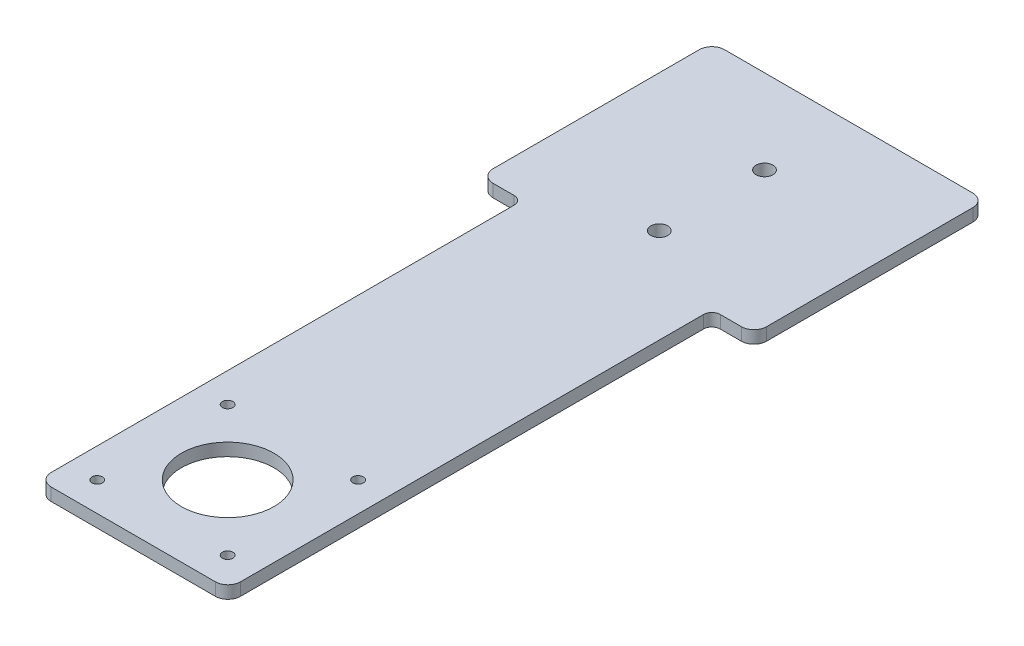
ISO-10303-21;
HEADER;
FILE_DESCRIPTION(('STEP AP214'),'2;1');
FILE_NAME('part.step','',(''),(''),'','','');
FILE_SCHEMA(('AUTOMOTIVE_DESIGN { 1 0 10303 214 1 1 1 1 }'));
ENDSEC;
DATA;
#1=APPLICATION_CONTEXT('core data for automotive mechanical design processes');
#2=APPLICATION_PROTOCOL_DEFINITION('international standard','automotive_design',2000,#1);
#3=PRODUCT_CONTEXT('',#1,'mechanical');
#4=PRODUCT('Part','Part','',(#3));
#5=PRODUCT_RELATED_PRODUCT_CATEGORY('part','',(#4));
#6=PRODUCT_DEFINITION_FORMATION('','',#4);
#7=PRODUCT_DEFINITION_CONTEXT('part definition',#1,'design');
#8=PRODUCT_DEFINITION('design','',#6,#7);
#9=PRODUCT_DEFINITION_SHAPE('','',#8);
#10=(LENGTH_UNIT() NAMED_UNIT(*) SI_UNIT(.MILLI.,.METRE.));
#11=(NAMED_UNIT(*) PLANE_ANGLE_UNIT() SI_UNIT($,.RADIAN.));
#12=(NAMED_UNIT(*) SI_UNIT($,.STERADIAN.) SOLID_ANGLE_UNIT());
#13=UNCERTAINTY_MEASURE_WITH_UNIT(LENGTH_MEASURE(1.E-05),#10,'distance_accuracy_value','');
#14=(GEOMETRIC_REPRESENTATION_CONTEXT(3) GLOBAL_UNCERTAINTY_ASSIGNED_CONTEXT((#13)) GLOBAL_UNIT_ASSIGNED_CONTEXT((#10,
#11,#12)) REPRESENTATION_CONTEXT('',''));
#15=CARTESIAN_POINT('',(0.,0.,0.));
#16=DIRECTION('',(0.,0.,1.));
#17=DIRECTION('',(1.,0.,0.));
#18=AXIS2_PLACEMENT_3D('',#15,#16,#17);
#19=CARTESIAN_POINT('',(-32.5,3.,0.));
#20=DIRECTION('',(1.,0.,0.));
#21=DIRECTION('',(0.,0.,-1.));
#22=AXIS2_PLACEMENT_3D('',#19,#20,#21);
#23=PLANE('',#22);
#24=DIRECTION('',(0.,0.,1.));
#25=VECTOR('',#24,1.);
#26=CARTESIAN_POINT('',(-32.5,0.,0.));
#27=LINE('',#26,#25);
#28=CARTESIAN_POINT('',(-32.5,0.,-108.613624170187));
#29=VERTEX_POINT('',#28);
#30=CARTESIAN_POINT('',(-32.5,0.,-59.6136241701869));
#31=VERTEX_POINT('',#30);
#32=EDGE_CURVE('E269',#29,#31,#27,.T.);
#33=ORIENTED_EDGE('',*,*,#32,.T.);
#34=DIRECTION('',(0.,-1.,0.));
#35=VECTOR('',#34,1.);
#36=CARTESIAN_POINT('',(-32.5,3.,-59.6136241701869));
#37=LINE('',#36,#35);
#38=CARTESIAN_POINT('',(-32.5,3.,-59.6136241701869));
#39=VERTEX_POINT('',#38);
#40=EDGE_CURVE('E202',#31,#39,#37,.F.);
#41=ORIENTED_EDGE('',*,*,#40,.T.);
#42=DIRECTION('',(0.,0.,1.));
#43=VECTOR('',#42,1.);
#44=CARTESIAN_POINT('',(-32.5,3.,0.));
#45=LINE('',#44,#43);
#46=CARTESIAN_POINT('',(-32.5,3.,-108.613624170187));
#47=VERTEX_POINT('',#46);
#48=EDGE_CURVE('E306',#47,#39,#45,.T.);
#49=ORIENTED_EDGE('',*,*,#48,.F.);
#50=DIRECTION('',(0.,-1.,0.));
#51=VECTOR('',#50,1.);
#52=CARTESIAN_POINT('',(-32.5,0.,-108.613624170187));
#53=LINE('',#52,#51);
#54=EDGE_CURVE('E189',#47,#29,#53,.T.);
#55=ORIENTED_EDGE('',*,*,#54,.T.);
#56=EDGE_LOOP('',(#33,#41,#49,#55));
#57=FACE_BOUND('',#56,.T.);
#58=ADVANCED_FACE('F41',(#57),#23,.F.);
#59=CARTESIAN_POINT('',(0.,3.,-56.613624170187));
#60=DIRECTION('',(0.,0.,-1.));
#61=DIRECTION('',(-1.,0.,0.));
#62=AXIS2_PLACEMENT_3D('',#59,#60,#61);
#63=PLANE('',#62);
#64=DIRECTION('',(1.,0.,0.));
#65=VECTOR('',#64,1.);
#66=CARTESIAN_POINT('',(0.,0.,-56.613624170187));
#67=LINE('',#66,#65);
#68=CARTESIAN_POINT('',(-29.5,0.,-56.6136241701869));
#69=VERTEX_POINT('',#68);
#70=CARTESIAN_POINT('',(-24.5,0.,-56.613624170187));
#71=VERTEX_POINT('',#70);
#72=EDGE_CURVE('E266',#69,#71,#67,.T.);
#73=ORIENTED_EDGE('',*,*,#72,.T.);
#74=DIRECTION('',(0.,-1.,0.));
#75=VECTOR('',#74,1.);
#76=CARTESIAN_POINT('',(-24.5,3.,-56.613624170187));
#77=LINE('',#76,#75);
#78=CARTESIAN_POINT('',(-24.5,3.,-56.613624170187));
#79=VERTEX_POINT('',#78);
#80=EDGE_CURVE('E238',#71,#79,#77,.F.);
#81=ORIENTED_EDGE('',*,*,#80,.T.);
#82=DIRECTION('',(1.,0.,0.));
#83=VECTOR('',#82,1.);
#84=CARTESIAN_POINT('',(0.,3.,-56.613624170187));
#85=LINE('',#84,#83);
#86=CARTESIAN_POINT('',(-29.5,3.,-56.6136241701869));
#87=VERTEX_POINT('',#86);
#88=EDGE_CURVE('E303',#87,#79,#85,.T.);
#89=ORIENTED_EDGE('',*,*,#88,.F.);
#90=DIRECTION('',(0.,-1.,0.));
#91=VECTOR('',#90,1.);
#92=CARTESIAN_POINT('',(-29.5,3.,-56.6136241701869));
#93=LINE('',#92,#91);
#94=EDGE_CURVE('E197',#87,#69,#93,.T.);
#95=ORIENTED_EDGE('',*,*,#94,.T.);
#96=EDGE_LOOP('',(#73,#81,#89,#95));
#97=FACE_BOUND('',#96,.T.);
#98=ADVANCED_FACE('F347',(#97),#63,.F.);
#99=CARTESIAN_POINT('',(-22.5,3.,0.));
#100=DIRECTION('',(-1.,0.,0.));
#101=DIRECTION('',(0.,0.,1.));
#102=AXIS2_PLACEMENT_3D('',#99,#100,#101);
#103=PLANE('',#102);
#104=DIRECTION('',(0.,0.,-1.));
#105=VECTOR('',#104,1.);
#106=CARTESIAN_POINT('',(-22.5,3.,0.));
#107=LINE('',#106,#105);
#108=CARTESIAN_POINT('',(-22.5,3.,55.3863758298131));
#109=VERTEX_POINT('',#108);
#110=CARTESIAN_POINT('',(-22.5,3.,-54.6136241701869));
#111=VERTEX_POINT('',#110);
#112=EDGE_CURVE('E300',#109,#111,#107,.T.);
#113=ORIENTED_EDGE('',*,*,#112,.T.);
#114=DIRECTION('',(0.,-1.,0.));
#115=VECTOR('',#114,1.);
#116=CARTESIAN_POINT('',(-22.5,3.,-54.6136241701869));
#117=LINE('',#116,#115);
#118=CARTESIAN_POINT('',(-22.5,0.,-54.6136241701869));
#119=VERTEX_POINT('',#118);
#120=EDGE_CURVE('E235',#111,#119,#117,.T.);
#121=ORIENTED_EDGE('',*,*,#120,.T.);
#122=DIRECTION('',(0.,0.,-1.));
#123=VECTOR('',#122,1.);
#124=CARTESIAN_POINT('',(-22.5,0.,0.));
#125=LINE('',#124,#123);
#126=CARTESIAN_POINT('',(-22.5,0.,55.3863758298131));
#127=VERTEX_POINT('',#126);
#128=EDGE_CURVE('E263',#127,#119,#125,.T.);
#129=ORIENTED_EDGE('',*,*,#128,.F.);
#130=DIRECTION('',(0.,-1.,0.));
#131=VECTOR('',#130,1.);
#132=CARTESIAN_POINT('',(-22.5,3.,55.3863758298131));
#133=LINE('',#132,#131);
#134=EDGE_CURVE('E231',#127,#109,#133,.F.);
#135=ORIENTED_EDGE('',*,*,#134,.T.);
#136=EDGE_LOOP('',(#113,#121,#129,#135));
#137=FACE_BOUND('',#136,.T.);
#138=ADVANCED_FACE('F353',(#137),#103,.T.);
#139=CARTESIAN_POINT('',(0.,3.,58.3863758298131));
#140=DIRECTION('',(0.,0.,1.));
#141=DIRECTION('',(1.,0.,0.));
#142=AXIS2_PLACEMENT_3D('',#139,#140,#141);
#143=PLANE('',#142);
#144=DIRECTION('',(-1.,0.,0.));
#145=VECTOR('',#144,1.);
#146=CARTESIAN_POINT('',(0.,3.,58.3863758298131));
#147=LINE('',#146,#145);
#148=CARTESIAN_POINT('',(19.5,3.,58.3863758298131));
#149=VERTEX_POINT('',#148);
#150=CARTESIAN_POINT('',(-19.5,3.,58.3863758298131));
#151=VERTEX_POINT('',#150);
#152=EDGE_CURVE('E297',#149,#151,#147,.T.);
#153=ORIENTED_EDGE('',*,*,#152,.T.);
#154=DIRECTION('',(0.,-1.,0.));
#155=VECTOR('',#154,1.);
#156=CARTESIAN_POINT('',(-19.5,3.,58.3863758298131));
#157=LINE('',#156,#155);
#158=CARTESIAN_POINT('',(-19.5,0.,58.3863758298131));
#159=VERTEX_POINT('',#158);
#160=EDGE_CURVE('E226',#151,#159,#157,.T.);
#161=ORIENTED_EDGE('',*,*,#160,.T.);
#162=DIRECTION('',(-1.,0.,0.));
#163=VECTOR('',#162,1.);
#164=CARTESIAN_POINT('',(0.,0.,58.3863758298131));
#165=LINE('',#164,#163);
#166=CARTESIAN_POINT('',(19.5,0.,58.3863758298131));
#167=VERTEX_POINT('',#166);
#168=EDGE_CURVE('E259',#167,#159,#165,.T.);
#169=ORIENTED_EDGE('',*,*,#168,.F.);
#170=DIRECTION('',(0.,-1.,0.));
#171=VECTOR('',#170,1.);
#172=CARTESIAN_POINT('',(19.5,3.,58.3863758298131));
#173=LINE('',#172,#171);
#174=EDGE_CURVE('E222',#167,#149,#173,.F.);
#175=ORIENTED_EDGE('',*,*,#174,.T.);
#176=EDGE_LOOP('',(#153,#161,#169,#175));
#177=FACE_BOUND('',#176,.T.);
#178=ADVANCED_FACE('F420',(#177),#143,.T.);
#179=CARTESIAN_POINT('',(22.5,3.,0.));
#180=DIRECTION('',(-1.,0.,0.));
#181=DIRECTION('',(0.,0.,1.));
#182=AXIS2_PLACEMENT_3D('',#179,#180,#181);
#183=PLANE('',#182);
#184=DIRECTION('',(0.,0.,-1.));
#185=VECTOR('',#184,1.);
#186=CARTESIAN_POINT('',(22.5,0.,0.));
#187=LINE('',#186,#185);
#188=CARTESIAN_POINT('',(22.5,0.,55.3863758298131));
#189=VERTEX_POINT('',#188);
#190=CARTESIAN_POINT('',(22.5,0.,-54.6136241701869));
#191=VERTEX_POINT('',#190);
#192=EDGE_CURVE('E256',#189,#191,#187,.T.);
#193=ORIENTED_EDGE('',*,*,#192,.T.);
#194=DIRECTION('',(0.,-1.,0.));
#195=VECTOR('',#194,1.);
#196=CARTESIAN_POINT('',(22.5,3.,-54.6136241701869));
#197=LINE('',#196,#195);
#198=CARTESIAN_POINT('',(22.5,3.,-54.6136241701869));
#199=VERTEX_POINT('',#198);
#200=EDGE_CURVE('E62',#191,#199,#197,.F.);
#201=ORIENTED_EDGE('',*,*,#200,.T.);
#202=DIRECTION('',(0.,0.,-1.));
#203=VECTOR('',#202,1.);
#204=CARTESIAN_POINT('',(22.5,3.,0.));
#205=LINE('',#204,#203);
#206=CARTESIAN_POINT('',(22.5,3.,55.3863758298131));
#207=VERTEX_POINT('',#206);
#208=EDGE_CURVE('E295',#207,#199,#205,.T.);
#209=ORIENTED_EDGE('',*,*,#208,.F.);
#210=DIRECTION('',(0.,-1.,0.));
#211=VECTOR('',#210,1.);
#212=CARTESIAN_POINT('',(22.5,0.,55.3863758298131));
#213=LINE('',#212,#211);
#214=EDGE_CURVE('E217',#207,#189,#213,.T.);
#215=ORIENTED_EDGE('',*,*,#214,.T.);
#216=EDGE_LOOP('',(#193,#201,#209,#215));
#217=FACE_BOUND('',#216,.T.);
#218=ADVANCED_FACE('F424',(#217),#183,.F.);
#219=CARTESIAN_POINT('',(0.,3.,-56.613624170187));
#220=DIRECTION('',(0.,0.,-1.));
#221=DIRECTION('',(-1.,0.,0.));
#222=AXIS2_PLACEMENT_3D('',#219,#220,#221);
#223=PLANE('',#222);
#224=DIRECTION('',(1.,0.,0.));
#225=VECTOR('',#224,1.);
#226=CARTESIAN_POINT('',(0.,3.,-56.613624170187));
#227=LINE('',#226,#225);
#228=CARTESIAN_POINT('',(24.5,3.,-56.613624170187));
#229=VERTEX_POINT('',#228);
#230=CARTESIAN_POINT('',(29.5,3.,-56.6136241701869));
#231=VERTEX_POINT('',#230);
#232=EDGE_CURVE('E252',#229,#231,#227,.T.);
#233=ORIENTED_EDGE('',*,*,#232,.F.);
#234=DIRECTION('',(0.,-1.,0.));
#235=VECTOR('',#234,1.);
#236=CARTESIAN_POINT('',(24.5,0.,-56.613624170187));
#237=LINE('',#236,#235);
#238=CARTESIAN_POINT('',(24.5,0.,-56.613624170187));
#239=VERTEX_POINT('',#238);
#240=EDGE_CURVE('E244',#229,#239,#237,.T.);
#241=ORIENTED_EDGE('',*,*,#240,.T.);
#242=DIRECTION('',(1.,0.,0.));
#243=VECTOR('',#242,1.);
#244=CARTESIAN_POINT('',(0.,0.,-56.613624170187));
#245=LINE('',#244,#243);
#246=CARTESIAN_POINT('',(29.5,0.,-56.6136241701869));
#247=VERTEX_POINT('',#246);
#248=EDGE_CURVE('E251',#239,#247,#245,.T.);
#249=ORIENTED_EDGE('',*,*,#248,.T.);
#250=DIRECTION('',(0.,-1.,0.));
#251=VECTOR('',#250,1.);
#252=CARTESIAN_POINT('',(29.5,3.,-56.6136241701869));
#253=LINE('',#252,#251);
#254=EDGE_CURVE('E212',#247,#231,#253,.F.);
#255=ORIENTED_EDGE('',*,*,#254,.T.);
#256=EDGE_LOOP('',(#233,#241,#249,#255));
#257=FACE_BOUND('',#256,.T.);
#258=ADVANCED_FACE('F250',(#257),#223,.F.);
#259=CARTESIAN_POINT('',(32.5,3.,0.));
#260=DIRECTION('',(1.,0.,0.));
#261=DIRECTION('',(0.,0.,-1.));
#262=AXIS2_PLACEMENT_3D('',#259,#260,#261);
#263=PLANE('',#262);
#264=DIRECTION('',(0.,0.,1.));
#265=VECTOR('',#264,1.);
#266=CARTESIAN_POINT('',(32.5,3.,0.));
#267=LINE('',#266,#265);
#268=CARTESIAN_POINT('',(32.5,3.,-108.613624170187));
#269=VERTEX_POINT('',#268);
#270=CARTESIAN_POINT('',(32.5,3.,-59.6136241701869));
#271=VERTEX_POINT('',#270);
#272=EDGE_CURVE('E291',#269,#271,#267,.T.);
#273=ORIENTED_EDGE('',*,*,#272,.T.);
#274=DIRECTION('',(0.,-1.,0.));
#275=VECTOR('',#274,1.);
#276=CARTESIAN_POINT('',(32.5,0.,-59.6136241701869));
#277=LINE('',#276,#275);
#278=CARTESIAN_POINT('',(32.5,0.,-59.6136241701869));
#279=VERTEX_POINT('',#278);
#280=EDGE_CURVE('E206',#271,#279,#277,.T.);
#281=ORIENTED_EDGE('',*,*,#280,.T.);
#282=DIRECTION('',(0.,0.,1.));
#283=VECTOR('',#282,1.);
#284=CARTESIAN_POINT('',(32.5,0.,0.));
#285=LINE('',#284,#283);
#286=CARTESIAN_POINT('',(32.5,0.,-108.613624170187));
#287=VERTEX_POINT('',#286);
#288=EDGE_CURVE('E166',#287,#279,#285,.T.);
#289=ORIENTED_EDGE('',*,*,#288,.F.);
#290=DIRECTION('',(0.,-1.,0.));
#291=VECTOR('',#290,1.);
#292=CARTESIAN_POINT('',(32.5,3.,-108.613624170187));
#293=LINE('',#292,#291);
#294=EDGE_CURVE('E174',#287,#269,#293,.F.);
#295=ORIENTED_EDGE('',*,*,#294,.T.);
#296=EDGE_LOOP('',(#273,#281,#289,#295));
#297=FACE_BOUND('',#296,.T.);
#298=ADVANCED_FACE('F436',(#297),#263,.T.);
#299=CARTESIAN_POINT('',(0.,3.,-111.613624170187));
#300=DIRECTION('',(0.,0.,-1.));
#301=DIRECTION('',(-1.,0.,0.));
#302=AXIS2_PLACEMENT_3D('',#299,#300,#301);
#303=PLANE('',#302);
#304=DIRECTION('',(1.,0.,0.));
#305=VECTOR('',#304,1.);
#306=CARTESIAN_POINT('',(0.,0.,-111.613624170187));
#307=LINE('',#306,#305);
#308=CARTESIAN_POINT('',(-29.5,0.,-111.613624170187));
#309=VERTEX_POINT('',#308);
#310=CARTESIAN_POINT('',(29.5,0.,-111.613624170187));
#311=VERTEX_POINT('',#310);
#312=EDGE_CURVE('E152',#309,#311,#307,.T.);
#313=ORIENTED_EDGE('',*,*,#312,.F.);
#314=DIRECTION('',(0.,-1.,0.));
#315=VECTOR('',#314,1.);
#316=CARTESIAN_POINT('',(-29.5,3.,-111.613624170187));
#317=LINE('',#316,#315);
#318=CARTESIAN_POINT('',(-29.5,3.,-111.613624170187));
#319=VERTEX_POINT('',#318);
#320=EDGE_CURVE('E193',#309,#319,#317,.F.);
#321=ORIENTED_EDGE('',*,*,#320,.T.);
#322=DIRECTION('',(1.,0.,0.));
#323=VECTOR('',#322,1.);
#324=CARTESIAN_POINT('',(0.,3.,-111.613624170187));
#325=LINE('',#324,#323);
#326=CARTESIAN_POINT('',(29.5,3.,-111.613624170187));
#327=VERTEX_POINT('',#326);
#328=EDGE_CURVE('E178',#319,#327,#325,.T.);
#329=ORIENTED_EDGE('',*,*,#328,.T.);
#330=DIRECTION('',(0.,-1.,0.));
#331=VECTOR('',#330,1.);
#332=CARTESIAN_POINT('',(29.5,3.,-111.613624170187));
#333=LINE('',#332,#331);
#334=EDGE_CURVE('E173',#327,#311,#333,.T.);
#335=ORIENTED_EDGE('',*,*,#334,.T.);
#336=EDGE_LOOP('',(#313,#321,#329,#335));
#337=FACE_BOUND('',#336,.T.);
#338=ADVANCED_FACE('F176',(#337),#303,.T.);
#339=CARTESIAN_POINT('',(0.,3.,-91.6136241701869));
#340=DIRECTION('',(0.,-1.,0.));
#341=DIRECTION('',(0.,0.,-1.));
#342=AXIS2_PLACEMENT_3D('',#339,#340,#341);
#343=CYLINDRICAL_SURFACE('',#342,2.);
#344=CARTESIAN_POINT('',(0.,3.,-91.6136241701869));
#345=DIRECTION('',(0.,1.,0.));
#346=DIRECTION('',(0.,0.,1.));
#347=AXIS2_PLACEMENT_3D('',#344,#345,#346);
#348=CIRCLE('',#347,2.);
#349=CARTESIAN_POINT('',(0.,3.,-89.6136241701869));
#350=VERTEX_POINT('',#349);
#351=EDGE_CURVE('E309',#350,#350,#348,.T.);
#352=ORIENTED_EDGE('',*,*,#351,.T.);
#353=EDGE_LOOP('',(#352));
#354=FACE_BOUND('',#353,.T.);
#355=CARTESIAN_POINT('',(0.,0.,-91.6136241701869));
#356=DIRECTION('',(0.,1.,0.));
#357=DIRECTION('',(0.,0.,1.));
#358=AXIS2_PLACEMENT_3D('',#355,#356,#357);
#359=CIRCLE('',#358,2.);
#360=CARTESIAN_POINT('',(0.,0.,-89.6136241701869));
#361=VERTEX_POINT('',#360);
#362=EDGE_CURVE('E272',#361,#361,#359,.T.);
#363=ORIENTED_EDGE('',*,*,#362,.F.);
#364=EDGE_LOOP('',(#363));
#365=FACE_BOUND('',#364,.T.);
#366=ADVANCED_FACE('F358',(#354,#365),#343,.F.);
#367=CARTESIAN_POINT('',(0.,3.,-66.6136241701869));
#368=DIRECTION('',(0.,-1.,0.));
#369=DIRECTION('',(0.,0.,-1.));
#370=AXIS2_PLACEMENT_3D('',#367,#368,#369);
#371=CYLINDRICAL_SURFACE('',#370,2.);
#372=CARTESIAN_POINT('',(0.,3.,-66.6136241701869));
#373=DIRECTION('',(0.,1.,0.));
#374=DIRECTION('',(0.,0.,1.));
#375=AXIS2_PLACEMENT_3D('',#372,#373,#374);
#376=CIRCLE('',#375,2.);
#377=CARTESIAN_POINT('',(0.,3.,-64.6136241701869));
#378=VERTEX_POINT('',#377);
#379=EDGE_CURVE('E312',#378,#378,#376,.T.);
#380=ORIENTED_EDGE('',*,*,#379,.T.);
#381=EDGE_LOOP('',(#380));
#382=FACE_BOUND('',#381,.T.);
#383=CARTESIAN_POINT('',(0.,0.,-66.6136241701869));
#384=DIRECTION('',(0.,1.,0.));
#385=DIRECTION('',(0.,0.,1.));
#386=AXIS2_PLACEMENT_3D('',#383,#384,#385);
#387=CIRCLE('',#386,2.);
#388=CARTESIAN_POINT('',(0.,0.,-64.6136241701869));
#389=VERTEX_POINT('',#388);
#390=EDGE_CURVE('E275',#389,#389,#387,.T.);
#391=ORIENTED_EDGE('',*,*,#390,.F.);
#392=EDGE_LOOP('',(#391));
#393=FACE_BOUND('',#392,.T.);
#394=ADVANCED_FACE('F361',(#382,#393),#371,.F.);
#395=CARTESIAN_POINT('',(-15.5,3.,20.4540396754964));
#396=DIRECTION('',(0.,-1.,0.));
#397=DIRECTION('',(0.,0.,-1.));
#398=AXIS2_PLACEMENT_3D('',#395,#396,#397);
#399=CYLINDRICAL_SURFACE('',#398,1.25);
#400=CARTESIAN_POINT('',(-15.5,3.,20.4540396754964));
#401=DIRECTION('',(0.,1.,0.));
#402=DIRECTION('',(0.,0.,1.));
#403=AXIS2_PLACEMENT_3D('',#400,#401,#402);
#404=CIRCLE('',#403,1.25);
#405=CARTESIAN_POINT('',(-15.5,3.,21.7040396754964));
#406=VERTEX_POINT('',#405);
#407=EDGE_CURVE('E315',#406,#406,#404,.T.);
#408=ORIENTED_EDGE('',*,*,#407,.T.);
#409=EDGE_LOOP('',(#408));
#410=FACE_BOUND('',#409,.T.);
#411=CARTESIAN_POINT('',(-15.5,0.,20.4540396754964));
#412=DIRECTION('',(0.,1.,0.));
#413=DIRECTION('',(0.,0.,1.));
#414=AXIS2_PLACEMENT_3D('',#411,#412,#413);
#415=CIRCLE('',#414,1.25);
#416=CARTESIAN_POINT('',(-15.5,0.,21.7040396754964));
#417=VERTEX_POINT('',#416);
#418=EDGE_CURVE('E278',#417,#417,#415,.T.);
#419=ORIENTED_EDGE('',*,*,#418,.F.);
#420=EDGE_LOOP('',(#419));
#421=FACE_BOUND('',#420,.T.);
#422=ADVANCED_FACE('F365',(#410,#421),#399,.F.);
#423=CARTESIAN_POINT('',(-15.5,3.,51.4540396754964));
#424=DIRECTION('',(0.,-1.,0.));
#425=DIRECTION('',(0.,0.,-1.));
#426=AXIS2_PLACEMENT_3D('',#423,#424,#425);
#427=CYLINDRICAL_SURFACE('',#426,1.25);
#428=CARTESIAN_POINT('',(-15.5,3.,51.4540396754964));
#429=DIRECTION('',(0.,1.,0.));
#430=DIRECTION('',(0.,0.,1.));
#431=AXIS2_PLACEMENT_3D('',#428,#429,#430);
#432=CIRCLE('',#431,1.25);
#433=CARTESIAN_POINT('',(-15.5,3.,52.7040396754964));
#434=VERTEX_POINT('',#433);
#435=EDGE_CURVE('E318',#434,#434,#432,.T.);
#436=ORIENTED_EDGE('',*,*,#435,.T.);
#437=EDGE_LOOP('',(#436));
#438=FACE_BOUND('',#437,.T.);
#439=CARTESIAN_POINT('',(-15.5,0.,51.4540396754964));
#440=DIRECTION('',(0.,1.,0.));
#441=DIRECTION('',(0.,0.,1.));
#442=AXIS2_PLACEMENT_3D('',#439,#440,#441);
#443=CIRCLE('',#442,1.25);
#444=CARTESIAN_POINT('',(-15.5,0.,52.7040396754964));
#445=VERTEX_POINT('',#444);
#446=EDGE_CURVE('E281',#445,#445,#443,.T.);
#447=ORIENTED_EDGE('',*,*,#446,.F.);
#448=EDGE_LOOP('',(#447));
#449=FACE_BOUND('',#448,.T.);
#450=ADVANCED_FACE('F369',(#438,#449),#427,.F.);
#451=CARTESIAN_POINT('',(15.5,3.,51.4540396754964));
#452=DIRECTION('',(0.,-1.,0.));
#453=DIRECTION('',(0.,0.,-1.));
#454=AXIS2_PLACEMENT_3D('',#451,#452,#453);
#455=CYLINDRICAL_SURFACE('',#454,1.25);
#456=CARTESIAN_POINT('',(15.5,3.,51.4540396754964));
#457=DIRECTION('',(0.,1.,0.));
#458=DIRECTION('',(0.,0.,1.));
#459=AXIS2_PLACEMENT_3D('',#456,#457,#458);
#460=CIRCLE('',#459,1.25);
#461=CARTESIAN_POINT('',(15.5,3.,52.7040396754964));
#462=VERTEX_POINT('',#461);
#463=EDGE_CURVE('E321',#462,#462,#460,.F.);
#464=ORIENTED_EDGE('',*,*,#463,.F.);
#465=EDGE_LOOP('',(#464));
#466=FACE_BOUND('',#465,.T.);
#467=CARTESIAN_POINT('',(15.5,0.,51.4540396754964));
#468=DIRECTION('',(0.,1.,0.));
#469=DIRECTION('',(0.,0.,1.));
#470=AXIS2_PLACEMENT_3D('',#467,#468,#469);
#471=CIRCLE('',#470,1.25);
#472=CARTESIAN_POINT('',(15.5,0.,52.7040396754964));
#473=VERTEX_POINT('',#472);
#474=EDGE_CURVE('E284',#473,#473,#471,.F.);
#475=ORIENTED_EDGE('',*,*,#474,.T.);
#476=EDGE_LOOP('',(#475));
#477=FACE_BOUND('',#476,.T.);
#478=ADVANCED_FACE('F373',(#466,#477),#455,.F.);
#479=CARTESIAN_POINT('',(0.,3.,35.9540396754964));
#480=DIRECTION('',(0.,-1.,0.));
#481=DIRECTION('',(0.,0.,-1.));
#482=AXIS2_PLACEMENT_3D('',#479,#480,#481);
#483=CYLINDRICAL_SURFACE('',#482,11.);
#484=CARTESIAN_POINT('',(0.,3.,35.9540396754964));
#485=DIRECTION('',(0.,1.,0.));
#486=DIRECTION('',(0.,0.,1.));
#487=AXIS2_PLACEMENT_3D('',#484,#485,#486);
#488=CIRCLE('',#487,11.);
#489=CARTESIAN_POINT('',(0.,3.,46.9540396754964));
#490=VERTEX_POINT('',#489);
#491=EDGE_CURVE('E324',#490,#490,#488,.T.);
#492=ORIENTED_EDGE('',*,*,#491,.T.);
#493=EDGE_LOOP('',(#492));
#494=FACE_BOUND('',#493,.T.);
#495=CARTESIAN_POINT('',(0.,0.,35.9540396754964));
#496=DIRECTION('',(0.,1.,0.));
#497=DIRECTION('',(0.,0.,1.));
#498=AXIS2_PLACEMENT_3D('',#495,#496,#497);
#499=CIRCLE('',#498,11.);
#500=CARTESIAN_POINT('',(0.,0.,46.9540396754964));
#501=VERTEX_POINT('',#500);
#502=EDGE_CURVE('E287',#501,#501,#499,.T.);
#503=ORIENTED_EDGE('',*,*,#502,.F.);
#504=EDGE_LOOP('',(#503));
#505=FACE_BOUND('',#504,.T.);
#506=ADVANCED_FACE('F377',(#494,#505),#483,.F.);
#507=CARTESIAN_POINT('',(15.5,3.,20.4540396754964));
#508=DIRECTION('',(0.,-1.,0.));
#509=DIRECTION('',(0.,0.,-1.));
#510=AXIS2_PLACEMENT_3D('',#507,#508,#509);
#511=CYLINDRICAL_SURFACE('',#510,1.25);
#512=CARTESIAN_POINT('',(15.5,3.,20.4540396754964));
#513=DIRECTION('',(0.,1.,0.));
#514=DIRECTION('',(0.,0.,1.));
#515=AXIS2_PLACEMENT_3D('',#512,#513,#514);
#516=CIRCLE('',#515,1.25);
#517=CARTESIAN_POINT('',(15.5,3.,21.7040396754964));
#518=VERTEX_POINT('',#517);
#519=EDGE_CURVE('E180',#518,#518,#516,.F.);
#520=ORIENTED_EDGE('',*,*,#519,.F.);
#521=EDGE_LOOP('',(#520));
#522=FACE_BOUND('',#521,.T.);
#523=CARTESIAN_POINT('',(15.5,0.,20.4540396754964));
#524=DIRECTION('',(0.,1.,0.));
#525=DIRECTION('',(0.,0.,1.));
#526=AXIS2_PLACEMENT_3D('',#523,#524,#525);
#527=CIRCLE('',#526,1.25);
#528=CARTESIAN_POINT('',(15.5,0.,21.7040396754964));
#529=VERTEX_POINT('',#528);
#530=EDGE_CURVE('E165',#529,#529,#527,.F.);
#531=ORIENTED_EDGE('',*,*,#530,.T.);
#532=EDGE_LOOP('',(#531));
#533=FACE_BOUND('',#532,.T.);
#534=ADVANCED_FACE('F331',(#522,#533),#511,.F.);
#535=CARTESIAN_POINT('',(0.,3.,0.));
#536=DIRECTION('',(0.,1.,0.));
#537=DIRECTION('',(0.,0.,1.));
#538=AXIS2_PLACEMENT_3D('',#535,#536,#537);
#539=PLANE('',#538);
#540=ORIENTED_EDGE('',*,*,#491,.F.);
#541=EDGE_LOOP('',(#540));
#542=FACE_BOUND('',#541,.T.);
#543=ORIENTED_EDGE('',*,*,#463,.T.);
#544=EDGE_LOOP('',(#543));
#545=FACE_BOUND('',#544,.T.);
#546=ORIENTED_EDGE('',*,*,#435,.F.);
#547=EDGE_LOOP('',(#546));
#548=FACE_BOUND('',#547,.T.);
#549=ORIENTED_EDGE('',*,*,#407,.F.);
#550=EDGE_LOOP('',(#549));
#551=FACE_BOUND('',#550,.T.);
#552=ORIENTED_EDGE('',*,*,#379,.F.);
#553=EDGE_LOOP('',(#552));
#554=FACE_BOUND('',#553,.T.);
#555=ORIENTED_EDGE('',*,*,#351,.F.);
#556=EDGE_LOOP('',(#555));
#557=FACE_BOUND('',#556,.T.);
#558=ORIENTED_EDGE('',*,*,#112,.F.);
#559=CARTESIAN_POINT('',(-19.5,3.,55.3863758298131));
#560=DIRECTION('',(0.,1.,0.));
#561=DIRECTION('',(0.,0.,1.));
#562=AXIS2_PLACEMENT_3D('',#559,#560,#561);
#563=CIRCLE('',#562,3.);
#564=EDGE_CURVE('E233',#109,#151,#563,.T.);
#565=ORIENTED_EDGE('',*,*,#564,.T.);
#566=ORIENTED_EDGE('',*,*,#152,.F.);
#567=CARTESIAN_POINT('',(19.5,3.,55.3863758298131));
#568=DIRECTION('',(0.,1.,0.));
#569=DIRECTION('',(0.,0.,1.));
#570=AXIS2_PLACEMENT_3D('',#567,#568,#569);
#571=CIRCLE('',#570,3.);
#572=EDGE_CURVE('E224',#149,#207,#571,.T.);
#573=ORIENTED_EDGE('',*,*,#572,.T.);
#574=ORIENTED_EDGE('',*,*,#208,.T.);
#575=CARTESIAN_POINT('',(24.5,3.,-54.6136241701869));
#576=DIRECTION('',(0.,1.,0.));
#577=DIRECTION('',(0.,0.,1.));
#578=AXIS2_PLACEMENT_3D('',#575,#576,#577);
#579=CIRCLE('',#578,2.);
#580=EDGE_CURVE('E11',#199,#229,#579,.F.);
#581=ORIENTED_EDGE('',*,*,#580,.T.);
#582=ORIENTED_EDGE('',*,*,#232,.T.);
#583=CARTESIAN_POINT('',(29.5,3.,-59.6136241701869));
#584=DIRECTION('',(0.,1.,0.));
#585=DIRECTION('',(0.,0.,1.));
#586=AXIS2_PLACEMENT_3D('',#583,#584,#585);
#587=CIRCLE('',#586,3.);
#588=EDGE_CURVE('E215',#231,#271,#587,.T.);
#589=ORIENTED_EDGE('',*,*,#588,.T.);
#590=ORIENTED_EDGE('',*,*,#272,.F.);
#591=CARTESIAN_POINT('',(29.5,3.,-108.613624170187));
#592=DIRECTION('',(0.,1.,0.));
#593=DIRECTION('',(0.,0.,1.));
#594=AXIS2_PLACEMENT_3D('',#591,#592,#593);
#595=CIRCLE('',#594,3.);
#596=EDGE_CURVE('E187',#269,#327,#595,.T.);
#597=ORIENTED_EDGE('',*,*,#596,.T.);
#598=ORIENTED_EDGE('',*,*,#328,.F.);
#599=CARTESIAN_POINT('',(-29.5,3.,-108.613624170187));
#600=DIRECTION('',(0.,1.,0.));
#601=DIRECTION('',(0.,0.,1.));
#602=AXIS2_PLACEMENT_3D('',#599,#600,#601);
#603=CIRCLE('',#602,3.);
#604=EDGE_CURVE('E195',#319,#47,#603,.T.);
#605=ORIENTED_EDGE('',*,*,#604,.T.);
#606=ORIENTED_EDGE('',*,*,#48,.T.);
#607=CARTESIAN_POINT('',(-29.5,3.,-59.6136241701869));
#608=DIRECTION('',(0.,1.,0.));
#609=DIRECTION('',(0.,0.,1.));
#610=AXIS2_PLACEMENT_3D('',#607,#608,#609);
#611=CIRCLE('',#610,3.);
#612=EDGE_CURVE('E204',#39,#87,#611,.T.);
#613=ORIENTED_EDGE('',*,*,#612,.T.);
#614=ORIENTED_EDGE('',*,*,#88,.T.);
#615=CARTESIAN_POINT('',(-24.5,3.,-54.6136241701869));
#616=DIRECTION('',(0.,1.,0.));
#617=DIRECTION('',(0.,0.,1.));
#618=AXIS2_PLACEMENT_3D('',#615,#616,#617);
#619=CIRCLE('',#618,2.);
#620=EDGE_CURVE('E242',#79,#111,#619,.F.);
#621=ORIENTED_EDGE('',*,*,#620,.T.);
#622=EDGE_LOOP('',(#558,#565,#566,#573,#574,#581,#582,#589,#590,#597,#598,#605,#606,#613,#614,#621));
#623=FACE_BOUND('',#622,.T.);
#624=ORIENTED_EDGE('',*,*,#519,.T.);
#625=EDGE_LOOP('',(#624));
#626=FACE_BOUND('',#625,.T.);
#627=ADVANCED_FACE('F333',(#542,#545,#548,#551,#554,#557,#623,#626),#539,.T.);
#628=CARTESIAN_POINT('',(0.,0.,0.));
#629=DIRECTION('',(0.,1.,0.));
#630=DIRECTION('',(0.,0.,1.));
#631=AXIS2_PLACEMENT_3D('',#628,#629,#630);
#632=PLANE('',#631);
#633=ORIENTED_EDGE('',*,*,#502,.T.);
#634=EDGE_LOOP('',(#633));
#635=FACE_BOUND('',#634,.T.);
#636=ORIENTED_EDGE('',*,*,#474,.F.);
#637=EDGE_LOOP('',(#636));
#638=FACE_BOUND('',#637,.T.);
#639=ORIENTED_EDGE('',*,*,#446,.T.);
#640=EDGE_LOOP('',(#639));
#641=FACE_BOUND('',#640,.T.);
#642=ORIENTED_EDGE('',*,*,#418,.T.);
#643=EDGE_LOOP('',(#642));
#644=FACE_BOUND('',#643,.T.);
#645=ORIENTED_EDGE('',*,*,#390,.T.);
#646=EDGE_LOOP('',(#645));
#647=FACE_BOUND('',#646,.T.);
#648=ORIENTED_EDGE('',*,*,#362,.T.);
#649=EDGE_LOOP('',(#648));
#650=FACE_BOUND('',#649,.T.);
#651=ORIENTED_EDGE('',*,*,#168,.T.);
#652=CARTESIAN_POINT('',(-19.5,0.,55.3863758298131));
#653=DIRECTION('',(0.,1.,0.));
#654=DIRECTION('',(0.,0.,1.));
#655=AXIS2_PLACEMENT_3D('',#652,#653,#654);
#656=CIRCLE('',#655,3.);
#657=EDGE_CURVE('E229',#159,#127,#656,.F.);
#658=ORIENTED_EDGE('',*,*,#657,.T.);
#659=ORIENTED_EDGE('',*,*,#128,.T.);
#660=CARTESIAN_POINT('',(-24.5,0.,-54.6136241701869));
#661=DIRECTION('',(0.,1.,0.));
#662=DIRECTION('',(0.,0.,1.));
#663=AXIS2_PLACEMENT_3D('',#660,#661,#662);
#664=CIRCLE('',#663,2.);
#665=EDGE_CURVE('E240',#119,#71,#664,.T.);
#666=ORIENTED_EDGE('',*,*,#665,.T.);
#667=ORIENTED_EDGE('',*,*,#72,.F.);
#668=CARTESIAN_POINT('',(-29.5,0.,-59.6136241701869));
#669=DIRECTION('',(0.,1.,0.));
#670=DIRECTION('',(0.,0.,1.));
#671=AXIS2_PLACEMENT_3D('',#668,#669,#670);
#672=CIRCLE('',#671,3.);
#673=EDGE_CURVE('E200',#69,#31,#672,.F.);
#674=ORIENTED_EDGE('',*,*,#673,.T.);
#675=ORIENTED_EDGE('',*,*,#32,.F.);
#676=CARTESIAN_POINT('',(-29.5,0.,-108.613624170187));
#677=DIRECTION('',(0.,1.,0.));
#678=DIRECTION('',(0.,0.,1.));
#679=AXIS2_PLACEMENT_3D('',#676,#677,#678);
#680=CIRCLE('',#679,3.);
#681=EDGE_CURVE('E161',#29,#309,#680,.F.);
#682=ORIENTED_EDGE('',*,*,#681,.T.);
#683=ORIENTED_EDGE('',*,*,#312,.T.);
#684=CARTESIAN_POINT('',(29.5,0.,-108.613624170187));
#685=DIRECTION('',(0.,1.,0.));
#686=DIRECTION('',(0.,0.,1.));
#687=AXIS2_PLACEMENT_3D('',#684,#685,#686);
#688=CIRCLE('',#687,3.);
#689=EDGE_CURVE('E158',#311,#287,#688,.F.);
#690=ORIENTED_EDGE('',*,*,#689,.T.);
#691=ORIENTED_EDGE('',*,*,#288,.T.);
#692=CARTESIAN_POINT('',(29.5,0.,-59.6136241701869));
#693=DIRECTION('',(0.,1.,0.));
#694=DIRECTION('',(0.,0.,1.));
#695=AXIS2_PLACEMENT_3D('',#692,#693,#694);
#696=CIRCLE('',#695,3.);
#697=EDGE_CURVE('E209',#279,#247,#696,.F.);
#698=ORIENTED_EDGE('',*,*,#697,.T.);
#699=ORIENTED_EDGE('',*,*,#248,.F.);
#700=CARTESIAN_POINT('',(24.5,0.,-54.6136241701869));
#701=DIRECTION('',(0.,1.,0.));
#702=DIRECTION('',(0.,0.,1.));
#703=AXIS2_PLACEMENT_3D('',#700,#701,#702);
#704=CIRCLE('',#703,2.);
#705=EDGE_CURVE('E49',#239,#191,#704,.T.);
#706=ORIENTED_EDGE('',*,*,#705,.T.);
#707=ORIENTED_EDGE('',*,*,#192,.F.);
#708=CARTESIAN_POINT('',(19.5,0.,55.3863758298131));
#709=DIRECTION('',(0.,1.,0.));
#710=DIRECTION('',(0.,0.,1.));
#711=AXIS2_PLACEMENT_3D('',#708,#709,#710);
#712=CIRCLE('',#711,3.);
#713=EDGE_CURVE('E220',#189,#167,#712,.F.);
#714=ORIENTED_EDGE('',*,*,#713,.T.);
#715=EDGE_LOOP('',(#651,#658,#659,#666,#667,#674,#675,#682,#683,#690,#691,#698,#699,#706,#707,#714));
#716=FACE_BOUND('',#715,.T.);
#717=ORIENTED_EDGE('',*,*,#530,.F.);
#718=EDGE_LOOP('',(#717));
#719=FACE_BOUND('',#718,.T.);
#720=ADVANCED_FACE('F155',(#635,#638,#641,#644,#647,#650,#716,#719),#632,.F.);
#721=CARTESIAN_POINT('',(29.5,3.,-108.613624170187));
#722=DIRECTION('',(0.,-1.,0.));
#723=DIRECTION('',(0.,0.,-1.));
#724=AXIS2_PLACEMENT_3D('',#721,#722,#723);
#725=CYLINDRICAL_SURFACE('',#724,3.);
#726=ORIENTED_EDGE('',*,*,#596,.F.);
#727=ORIENTED_EDGE('',*,*,#294,.F.);
#728=ORIENTED_EDGE('',*,*,#689,.F.);
#729=ORIENTED_EDGE('',*,*,#334,.F.);
#730=EDGE_LOOP('',(#726,#727,#728,#729));
#731=FACE_BOUND('',#730,.T.);
#732=ADVANCED_FACE('F172',(#731),#725,.T.);
#733=CARTESIAN_POINT('',(-29.5,3.,-108.613624170187));
#734=DIRECTION('',(0.,1.,0.));
#735=DIRECTION('',(0.,0.,1.));
#736=AXIS2_PLACEMENT_3D('',#733,#734,#735);
#737=CYLINDRICAL_SURFACE('',#736,3.);
#738=ORIENTED_EDGE('',*,*,#604,.F.);
#739=ORIENTED_EDGE('',*,*,#320,.F.);
#740=ORIENTED_EDGE('',*,*,#681,.F.);
#741=ORIENTED_EDGE('',*,*,#54,.F.);
#742=EDGE_LOOP('',(#738,#739,#740,#741));
#743=FACE_BOUND('',#742,.T.);
#744=ADVANCED_FACE('F340',(#743),#737,.T.);
#745=CARTESIAN_POINT('',(-29.5,3.,-59.6136241701869));
#746=DIRECTION('',(0.,-1.,0.));
#747=DIRECTION('',(0.,0.,-1.));
#748=AXIS2_PLACEMENT_3D('',#745,#746,#747);
#749=CYLINDRICAL_SURFACE('',#748,3.);
#750=ORIENTED_EDGE('',*,*,#612,.F.);
#751=ORIENTED_EDGE('',*,*,#40,.F.);
#752=ORIENTED_EDGE('',*,*,#673,.F.);
#753=ORIENTED_EDGE('',*,*,#94,.F.);
#754=EDGE_LOOP('',(#750,#751,#752,#753));
#755=FACE_BOUND('',#754,.T.);
#756=ADVANCED_FACE('F383',(#755),#749,.T.);
#757=CARTESIAN_POINT('',(29.5,3.,-59.6136241701869));
#758=DIRECTION('',(0.,1.,0.));
#759=DIRECTION('',(0.,0.,1.));
#760=AXIS2_PLACEMENT_3D('',#757,#758,#759);
#761=CYLINDRICAL_SURFACE('',#760,3.);
#762=ORIENTED_EDGE('',*,*,#588,.F.);
#763=ORIENTED_EDGE('',*,*,#254,.F.);
#764=ORIENTED_EDGE('',*,*,#697,.F.);
#765=ORIENTED_EDGE('',*,*,#280,.F.);
#766=EDGE_LOOP('',(#762,#763,#764,#765));
#767=FACE_BOUND('',#766,.T.);
#768=ADVANCED_FACE('F387',(#767),#761,.T.);
#769=CARTESIAN_POINT('',(19.5,3.,55.3863758298131));
#770=DIRECTION('',(0.,1.,0.));
#771=DIRECTION('',(0.,0.,1.));
#772=AXIS2_PLACEMENT_3D('',#769,#770,#771);
#773=CYLINDRICAL_SURFACE('',#772,3.);
#774=ORIENTED_EDGE('',*,*,#572,.F.);
#775=ORIENTED_EDGE('',*,*,#174,.F.);
#776=ORIENTED_EDGE('',*,*,#713,.F.);
#777=ORIENTED_EDGE('',*,*,#214,.F.);
#778=EDGE_LOOP('',(#774,#775,#776,#777));
#779=FACE_BOUND('',#778,.T.);
#780=ADVANCED_FACE('F391',(#779),#773,.T.);
#781=CARTESIAN_POINT('',(-19.5,3.,55.3863758298131));
#782=DIRECTION('',(0.,-1.,0.));
#783=DIRECTION('',(0.,0.,-1.));
#784=AXIS2_PLACEMENT_3D('',#781,#782,#783);
#785=CYLINDRICAL_SURFACE('',#784,3.);
#786=ORIENTED_EDGE('',*,*,#564,.F.);
#787=ORIENTED_EDGE('',*,*,#134,.F.);
#788=ORIENTED_EDGE('',*,*,#657,.F.);
#789=ORIENTED_EDGE('',*,*,#160,.F.);
#790=EDGE_LOOP('',(#786,#787,#788,#789));
#791=FACE_BOUND('',#790,.T.);
#792=ADVANCED_FACE('F395',(#791),#785,.T.);
#793=CARTESIAN_POINT('',(-24.5,3.,-54.6136241701869));
#794=DIRECTION('',(0.,-1.,0.));
#795=DIRECTION('',(0.,0.,-1.));
#796=AXIS2_PLACEMENT_3D('',#793,#794,#795);
#797=CYLINDRICAL_SURFACE('',#796,2.);
#798=ORIENTED_EDGE('',*,*,#620,.F.);
#799=ORIENTED_EDGE('',*,*,#80,.F.);
#800=ORIENTED_EDGE('',*,*,#665,.F.);
#801=ORIENTED_EDGE('',*,*,#120,.F.);
#802=EDGE_LOOP('',(#798,#799,#800,#801));
#803=FACE_BOUND('',#802,.T.);
#804=ADVANCED_FACE('F398',(#803),#797,.F.);
#805=CARTESIAN_POINT('',(24.5,3.,-54.6136241701869));
#806=DIRECTION('',(0.,1.,0.));
#807=DIRECTION('',(0.,0.,1.));
#808=AXIS2_PLACEMENT_3D('',#805,#806,#807);
#809=CYLINDRICAL_SURFACE('',#808,2.);
#810=ORIENTED_EDGE('',*,*,#580,.F.);
#811=ORIENTED_EDGE('',*,*,#200,.F.);
#812=ORIENTED_EDGE('',*,*,#705,.F.);
#813=ORIENTED_EDGE('',*,*,#240,.F.);
#814=EDGE_LOOP('',(#810,#811,#812,#813));
#815=FACE_BOUND('',#814,.T.);
#816=ADVANCED_FACE('F43',(#815),#809,.F.);
#817=CLOSED_SHELL('',(#58,#98,#138,#178,#218,#258,#298,#338,#366,#394,#422,#450,#478,#506,#534,
#627,#720,#732,#744,#756,#768,#780,#792,#804,#816));
#818=MANIFOLD_SOLID_BREP('B2',#817);
#819=ADVANCED_BREP_SHAPE_REPRESENTATION('',(#18,#818),#14);
#820=SHAPE_DEFINITION_REPRESENTATION(#9,#819);
ENDSEC;
END-ISO-10303-21;
